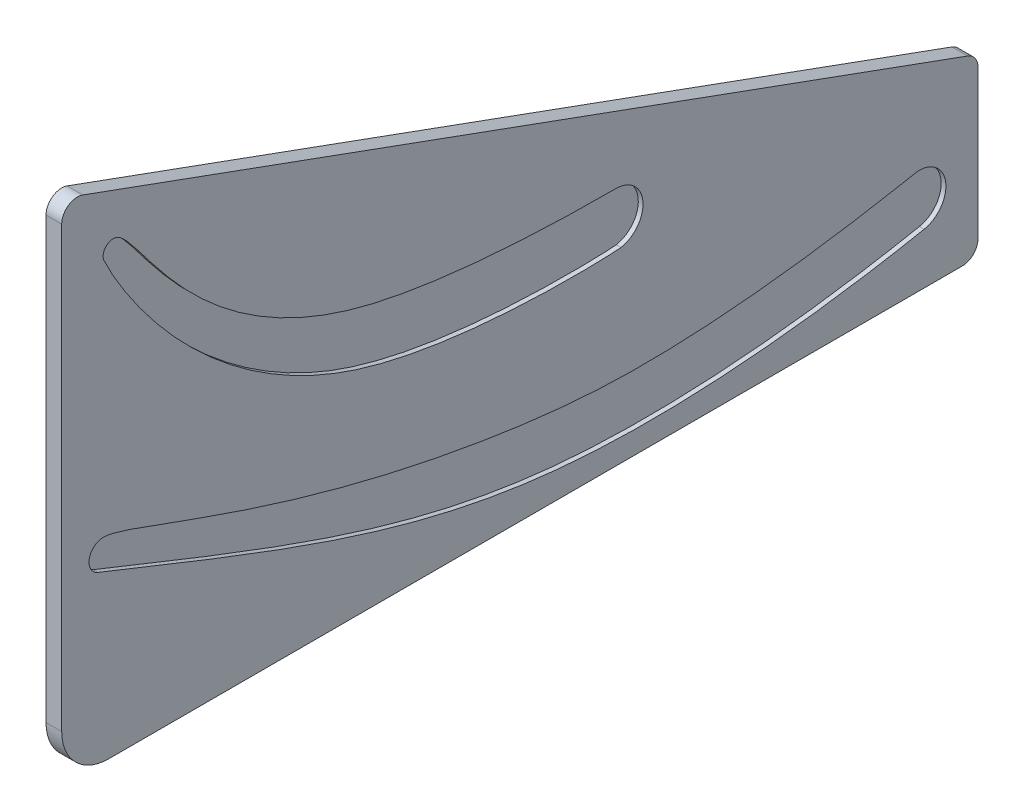
ISO-10303-21;
HEADER;
FILE_DESCRIPTION(('STEP AP214'),'2;1');
FILE_NAME('part.step','',(''),(''),'','','');
FILE_SCHEMA(('AUTOMOTIVE_DESIGN { 1 0 10303 214 1 1 1 1 }'));
ENDSEC;
DATA;
#1=APPLICATION_CONTEXT('core data for automotive mechanical design processes');
#2=APPLICATION_PROTOCOL_DEFINITION('international standard','automotive_design',2000,#1);
#3=PRODUCT_CONTEXT('',#1,'mechanical');
#4=PRODUCT('Part','Part','',(#3));
#5=PRODUCT_RELATED_PRODUCT_CATEGORY('part','',(#4));
#6=PRODUCT_DEFINITION_FORMATION('','',#4);
#7=PRODUCT_DEFINITION_CONTEXT('part definition',#1,'design');
#8=PRODUCT_DEFINITION('design','',#6,#7);
#9=PRODUCT_DEFINITION_SHAPE('','',#8);
#10=(LENGTH_UNIT() NAMED_UNIT(*) SI_UNIT(.MILLI.,.METRE.));
#11=(NAMED_UNIT(*) PLANE_ANGLE_UNIT() SI_UNIT($,.RADIAN.));
#12=(NAMED_UNIT(*) SI_UNIT($,.STERADIAN.) SOLID_ANGLE_UNIT());
#13=UNCERTAINTY_MEASURE_WITH_UNIT(LENGTH_MEASURE(1.E-05),#10,'distance_accuracy_value','');
#14=(GEOMETRIC_REPRESENTATION_CONTEXT(3) GLOBAL_UNCERTAINTY_ASSIGNED_CONTEXT((#13)) GLOBAL_UNIT_ASSIGNED_CONTEXT((#10,
#11,#12)) REPRESENTATION_CONTEXT('',''));
#15=CARTESIAN_POINT('',(0.,0.,0.));
#16=DIRECTION('',(0.,0.,1.));
#17=DIRECTION('',(1.,0.,0.));
#18=AXIS2_PLACEMENT_3D('',#15,#16,#17);
#19=CARTESIAN_POINT('',(10.,-294.281480067421,-30.));
#20=DIRECTION('',(-1.,0.,0.));
#21=DIRECTION('',(0.,0.,1.));
#22=AXIS2_PLACEMENT_3D('',#19,#20,#21);
#23=CYLINDRICAL_SURFACE('',#22,30.);
#24=CARTESIAN_POINT('',(0.,-294.281480067421,-30.));
#25=DIRECTION('',(1.,0.,0.));
#26=DIRECTION('',(0.,0.,1.));
#27=AXIS2_PLACEMENT_3D('',#24,#25,#26);
#28=CIRCLE('',#27,30.);
#29=CARTESIAN_POINT('',(0.,-294.281480067421,0.));
#30=VERTEX_POINT('',#29);
#31=CARTESIAN_POINT('',(0.,-324.281480067421,-30.));
#32=VERTEX_POINT('',#31);
#33=EDGE_CURVE('E310',#30,#32,#28,.T.);
#34=ORIENTED_EDGE('',*,*,#33,.T.);
#35=DIRECTION('',(-1.,0.,0.));
#36=VECTOR('',#35,1.);
#37=CARTESIAN_POINT('',(10.,-324.281480067421,-30.));
#38=LINE('',#37,#36);
#39=CARTESIAN_POINT('',(10.,-324.281480067421,-30.));
#40=VERTEX_POINT('',#39);
#41=EDGE_CURVE('E11',#40,#32,#38,.T.);
#42=ORIENTED_EDGE('',*,*,#41,.F.);
#43=CARTESIAN_POINT('',(10.,-294.281480067421,-30.));
#44=DIRECTION('',(1.,0.,0.));
#45=DIRECTION('',(0.,0.,1.));
#46=AXIS2_PLACEMENT_3D('',#43,#44,#45);
#47=CIRCLE('',#46,30.);
#48=CARTESIAN_POINT('',(10.,-294.281480067421,0.));
#49=VERTEX_POINT('',#48);
#50=EDGE_CURVE('E320',#49,#40,#47,.T.);
#51=ORIENTED_EDGE('',*,*,#50,.F.);
#52=DIRECTION('',(-1.,0.,0.));
#53=VECTOR('',#52,1.);
#54=CARTESIAN_POINT('',(10.,-294.281480067421,0.));
#55=LINE('',#54,#53);
#56=EDGE_CURVE('E346',#49,#30,#55,.T.);
#57=ORIENTED_EDGE('',*,*,#56,.T.);
#58=EDGE_LOOP('',(#34,#42,#51,#57));
#59=FACE_BOUND('',#58,.T.);
#60=ADVANCED_FACE('F38',(#59),#23,.T.);
#61=CARTESIAN_POINT('',(10.,-324.281480067421,-30.));
#62=DIRECTION('',(0.,1.,0.));
#63=DIRECTION('',(0.,0.,1.));
#64=AXIS2_PLACEMENT_3D('',#61,#62,#63);
#65=PLANE('',#64);
#66=DIRECTION('',(0.,0.,-1.));
#67=VECTOR('',#66,1.);
#68=CARTESIAN_POINT('',(0.,-324.281480067421,-30.));
#69=LINE('',#68,#67);
#70=CARTESIAN_POINT('',(0.,-324.281480067421,-573.815572471544));
#71=VERTEX_POINT('',#70);
#72=EDGE_CURVE('E350',#32,#71,#69,.T.);
#73=ORIENTED_EDGE('',*,*,#72,.T.);
#74=DIRECTION('',(-1.,0.,0.));
#75=VECTOR('',#74,1.);
#76=CARTESIAN_POINT('',(10.,-324.281480067421,-573.815572471544));
#77=LINE('',#76,#75);
#78=CARTESIAN_POINT('',(10.,-324.281480067421,-573.815572471544));
#79=VERTEX_POINT('',#78);
#80=EDGE_CURVE('E46',#79,#71,#77,.T.);
#81=ORIENTED_EDGE('',*,*,#80,.F.);
#82=DIRECTION('',(0.,0.,-1.));
#83=VECTOR('',#82,1.);
#84=CARTESIAN_POINT('',(10.,-324.281480067421,-30.));
#85=LINE('',#84,#83);
#86=EDGE_CURVE('E324',#40,#79,#85,.T.);
#87=ORIENTED_EDGE('',*,*,#86,.F.);
#88=ORIENTED_EDGE('',*,*,#41,.T.);
#89=EDGE_LOOP('',(#73,#81,#87,#88));
#90=FACE_BOUND('',#89,.T.);
#91=ADVANCED_FACE('F421',(#90),#65,.F.);
#92=CARTESIAN_POINT('',(10.,-314.281480067421,-573.815572471544));
#93=DIRECTION('',(-1.,0.,0.));
#94=DIRECTION('',(0.,0.,1.));
#95=AXIS2_PLACEMENT_3D('',#92,#93,#94);
#96=CYLINDRICAL_SURFACE('',#95,10.);
#97=CARTESIAN_POINT('',(0.,-314.281480067421,-573.815572471544));
#98=DIRECTION('',(1.,0.,0.));
#99=DIRECTION('',(0.,0.,-1.));
#100=AXIS2_PLACEMENT_3D('',#97,#98,#99);
#101=CIRCLE('',#100,10.);
#102=CARTESIAN_POINT('',(0.,-314.281480067421,-583.815572471544));
#103=VERTEX_POINT('',#102);
#104=EDGE_CURVE('E353',#71,#103,#101,.T.);
#105=ORIENTED_EDGE('',*,*,#104,.T.);
#106=DIRECTION('',(-1.,0.,0.));
#107=VECTOR('',#106,1.);
#108=CARTESIAN_POINT('',(10.,-314.281480067421,-583.815572471544));
#109=LINE('',#108,#107);
#110=CARTESIAN_POINT('',(10.,-314.281480067421,-583.815572471544));
#111=VERTEX_POINT('',#110);
#112=EDGE_CURVE('E389',#111,#103,#109,.T.);
#113=ORIENTED_EDGE('',*,*,#112,.F.);
#114=CARTESIAN_POINT('',(10.,-314.281480067421,-573.815572471544));
#115=DIRECTION('',(1.,0.,0.));
#116=DIRECTION('',(0.,0.,-1.));
#117=AXIS2_PLACEMENT_3D('',#114,#115,#116);
#118=CIRCLE('',#117,10.);
#119=EDGE_CURVE('E328',#79,#111,#118,.T.);
#120=ORIENTED_EDGE('',*,*,#119,.F.);
#121=ORIENTED_EDGE('',*,*,#80,.T.);
#122=EDGE_LOOP('',(#105,#113,#120,#121));
#123=FACE_BOUND('',#122,.T.);
#124=ADVANCED_FACE('F398',(#123),#96,.T.);
#125=CARTESIAN_POINT('',(10.,-314.281480067421,-583.815572471544));
#126=DIRECTION('',(0.,0.,1.));
#127=DIRECTION('',(1.,0.,0.));
#128=AXIS2_PLACEMENT_3D('',#125,#126,#127);
#129=PLANE('',#128);
#130=DIRECTION('',(0.,1.,0.));
#131=VECTOR('',#130,1.);
#132=CARTESIAN_POINT('',(0.,-314.281480067421,-583.815572471544));
#133=LINE('',#132,#131);
#134=CARTESIAN_POINT('',(0.,-219.493566062825,-583.815572471544));
#135=VERTEX_POINT('',#134);
#136=EDGE_CURVE('E356',#103,#135,#133,.T.);
#137=ORIENTED_EDGE('',*,*,#136,.T.);
#138=DIRECTION('',(-1.,0.,0.));
#139=VECTOR('',#138,1.);
#140=CARTESIAN_POINT('',(10.,-219.493566062825,-583.815572471544));
#141=LINE('',#140,#139);
#142=CARTESIAN_POINT('',(10.,-219.493566062825,-583.815572471544));
#143=VERTEX_POINT('',#142);
#144=EDGE_CURVE('E385',#143,#135,#141,.T.);
#145=ORIENTED_EDGE('',*,*,#144,.F.);
#146=DIRECTION('',(0.,1.,0.));
#147=VECTOR('',#146,1.);
#148=CARTESIAN_POINT('',(10.,-314.281480067421,-583.815572471544));
#149=LINE('',#148,#147);
#150=EDGE_CURVE('E331',#111,#143,#149,.T.);
#151=ORIENTED_EDGE('',*,*,#150,.F.);
#152=ORIENTED_EDGE('',*,*,#112,.T.);
#153=EDGE_LOOP('',(#137,#145,#151,#152));
#154=FACE_BOUND('',#153,.T.);
#155=ADVANCED_FACE('F409',(#154),#129,.F.);
#156=CARTESIAN_POINT('',(10.,-219.493566062825,-573.815572471544));
#157=DIRECTION('',(-1.,0.,0.));
#158=DIRECTION('',(0.,0.,1.));
#159=AXIS2_PLACEMENT_3D('',#156,#157,#158);
#160=CYLINDRICAL_SURFACE('',#159,10.);
#161=CARTESIAN_POINT('',(0.,-219.493566062825,-573.815572471544));
#162=DIRECTION('',(1.,0.,0.));
#163=DIRECTION('',(0.,0.,-1.));
#164=AXIS2_PLACEMENT_3D('',#161,#162,#163);
#165=CIRCLE('',#164,10.);
#166=CARTESIAN_POINT('',(0.,-210.096639854966,-577.235773904801));
#167=VERTEX_POINT('',#166);
#168=EDGE_CURVE('E359',#135,#167,#165,.T.);
#169=ORIENTED_EDGE('',*,*,#168,.T.);
#170=DIRECTION('',(-1.,0.,0.));
#171=VECTOR('',#170,1.);
#172=CARTESIAN_POINT('',(10.,-210.096639854966,-577.235773904801));
#173=LINE('',#172,#171);
#174=CARTESIAN_POINT('',(10.,-210.096639854966,-577.235773904801));
#175=VERTEX_POINT('',#174);
#176=EDGE_CURVE('E381',#175,#167,#173,.T.);
#177=ORIENTED_EDGE('',*,*,#176,.F.);
#178=CARTESIAN_POINT('',(10.,-219.493566062825,-573.815572471544));
#179=DIRECTION('',(1.,0.,0.));
#180=DIRECTION('',(0.,0.,-1.));
#181=AXIS2_PLACEMENT_3D('',#178,#179,#180);
#182=CIRCLE('',#181,10.);
#183=EDGE_CURVE('E334',#143,#175,#182,.T.);
#184=ORIENTED_EDGE('',*,*,#183,.F.);
#185=ORIENTED_EDGE('',*,*,#144,.T.);
#186=EDGE_LOOP('',(#169,#177,#184,#185));
#187=FACE_BOUND('',#186,.T.);
#188=ADVANCED_FACE('F413',(#187),#160,.T.);
#189=CARTESIAN_POINT('',(10.,-210.096639854966,-577.235773904801));
#190=DIRECTION('',(0.,-0.939692620785907,0.342020143325672));
#191=DIRECTION('',(0.,-0.342020143325672,-0.939692620785907));
#192=AXIS2_PLACEMENT_3D('',#189,#190,#191);
#193=PLANE('',#192);
#194=DIRECTION('',(0.,0.342020143325672,0.939692620785907));
#195=VECTOR('',#194,1.);
#196=CARTESIAN_POINT('',(0.,-210.096639854966,-577.235773904801));
#197=LINE('',#196,#195);
#198=CARTESIAN_POINT('',(0.,-4.88455385956217,-13.4202014332568));
#199=VERTEX_POINT('',#198);
#200=EDGE_CURVE('E362',#167,#199,#197,.T.);
#201=ORIENTED_EDGE('',*,*,#200,.T.);
#202=DIRECTION('',(-1.,0.,0.));
#203=VECTOR('',#202,1.);
#204=CARTESIAN_POINT('',(10.,-4.88455385956217,-13.4202014332568));
#205=LINE('',#204,#203);
#206=CARTESIAN_POINT('',(10.,-4.88455385956217,-13.4202014332568));
#207=VERTEX_POINT('',#206);
#208=EDGE_CURVE('E377',#207,#199,#205,.T.);
#209=ORIENTED_EDGE('',*,*,#208,.F.);
#210=DIRECTION('',(0.,0.342020143325672,0.939692620785907));
#211=VECTOR('',#210,1.);
#212=CARTESIAN_POINT('',(10.,-210.096639854966,-577.235773904801));
#213=LINE('',#212,#211);
#214=EDGE_CURVE('E337',#175,#207,#213,.T.);
#215=ORIENTED_EDGE('',*,*,#214,.F.);
#216=ORIENTED_EDGE('',*,*,#176,.T.);
#217=EDGE_LOOP('',(#201,#209,#215,#216));
#218=FACE_BOUND('',#217,.T.);
#219=ADVANCED_FACE('F434',(#218),#193,.F.);
#220=CARTESIAN_POINT('',(10.,-14.2814800674212,-10.));
#221=DIRECTION('',(-1.,0.,0.));
#222=DIRECTION('',(0.,0.,1.));
#223=AXIS2_PLACEMENT_3D('',#220,#221,#222);
#224=CYLINDRICAL_SURFACE('',#223,10.);
#225=CARTESIAN_POINT('',(0.,-14.2814800674212,-10.));
#226=DIRECTION('',(1.,0.,0.));
#227=DIRECTION('',(0.,0.,-1.));
#228=AXIS2_PLACEMENT_3D('',#225,#226,#227);
#229=CIRCLE('',#228,10.);
#230=CARTESIAN_POINT('',(0.,-14.2814800674213,0.));
#231=VERTEX_POINT('',#230);
#232=EDGE_CURVE('E365',#199,#231,#229,.T.);
#233=ORIENTED_EDGE('',*,*,#232,.T.);
#234=DIRECTION('',(-1.,0.,0.));
#235=VECTOR('',#234,1.);
#236=CARTESIAN_POINT('',(10.,-14.2814800674213,0.));
#237=LINE('',#236,#235);
#238=CARTESIAN_POINT('',(10.,-14.2814800674213,0.));
#239=VERTEX_POINT('',#238);
#240=EDGE_CURVE('E373',#239,#231,#237,.T.);
#241=ORIENTED_EDGE('',*,*,#240,.F.);
#242=CARTESIAN_POINT('',(10.,-14.2814800674212,-10.));
#243=DIRECTION('',(1.,0.,0.));
#244=DIRECTION('',(0.,0.,-1.));
#245=AXIS2_PLACEMENT_3D('',#242,#243,#244);
#246=CIRCLE('',#245,10.);
#247=EDGE_CURVE('E340',#207,#239,#246,.T.);
#248=ORIENTED_EDGE('',*,*,#247,.F.);
#249=ORIENTED_EDGE('',*,*,#208,.T.);
#250=EDGE_LOOP('',(#233,#241,#248,#249));
#251=FACE_BOUND('',#250,.T.);
#252=ADVANCED_FACE('F432',(#251),#224,.T.);
#253=CARTESIAN_POINT('',(10.,-14.2814800674213,0.));
#254=DIRECTION('',(0.,0.,-1.));
#255=DIRECTION('',(0.,1.,0.));
#256=AXIS2_PLACEMENT_3D('',#253,#254,#255);
#257=PLANE('',#256);
#258=DIRECTION('',(0.,-1.,0.));
#259=VECTOR('',#258,1.);
#260=CARTESIAN_POINT('',(0.,-14.2814800674213,0.));
#261=LINE('',#260,#259);
#262=EDGE_CURVE('E325',#231,#30,#261,.T.);
#263=ORIENTED_EDGE('',*,*,#262,.T.);
#264=ORIENTED_EDGE('',*,*,#56,.F.);
#265=DIRECTION('',(0.,-1.,0.));
#266=VECTOR('',#265,1.);
#267=CARTESIAN_POINT('',(10.,-14.2814800674213,0.));
#268=LINE('',#267,#266);
#269=EDGE_CURVE('E343',#239,#49,#268,.T.);
#270=ORIENTED_EDGE('',*,*,#269,.F.);
#271=ORIENTED_EDGE('',*,*,#240,.T.);
#272=EDGE_LOOP('',(#263,#264,#270,#271));
#273=FACE_BOUND('',#272,.T.);
#274=ADVANCED_FACE('F427',(#273),#257,.F.);
#275=CARTESIAN_POINT('',(10.,-294.281480067421,-30.));
#276=DIRECTION('',(-1.,0.,0.));
#277=DIRECTION('',(0.,0.,1.));
#278=AXIS2_PLACEMENT_3D('',#275,#276,#277);
#279=PLANE('',#278);
#280=CARTESIAN_POINT('',(10.,-45.1404123394199,-32.8167854808913));
#281=DIRECTION('',(1.,0.,0.));
#282=DIRECTION('',(0.,0.,1.));
#283=AXIS2_PLACEMENT_3D('',#280,#281,#282);
#284=CIRCLE('',#283,6.41563538252756);
#285=CARTESIAN_POINT('',(10.,-39.1543533593346,-35.1249178966076));
#286=VERTEX_POINT('',#285);
#287=CARTESIAN_POINT('',(10.,-47.7372149956287,-26.9501856712703));
#288=VERTEX_POINT('',#287);
#289=EDGE_CURVE('E638',#286,#288,#284,.T.);
#290=ORIENTED_EDGE('',*,*,#289,.F.);
#291=CARTESIAN_POINT('',(10.,-171.181734297002,-353.169530365349));
#292=CARTESIAN_POINT('',(10.,-171.181746235272,-331.224003862466));
#293=CARTESIAN_POINT('',(10.,-170.661871262547,-99.0425390004754));
#294=CARTESIAN_POINT('',(10.,-45.1224459351378,-50.6029528282735));
#295=CARTESIAN_POINT('',(10.,-39.1543533593346,-35.1249178966076));
#296=B_SPLINE_CURVE_WITH_KNOTS('',3,(#291,#292,#293,#294,#295),.UNSPECIFIED.,.F.,.F.,(4,1,4),
(0.,0.360804402812459,1.),.UNSPECIFIED.);
#297=CARTESIAN_POINT('',(10.,-171.181734297002,-353.169530365349));
#298=VERTEX_POINT('',#297);
#299=EDGE_CURVE('E61',#298,#286,#296,.T.);
#300=ORIENTED_EDGE('',*,*,#299,.F.);
#301=CARTESIAN_POINT('',(10.,-188.394419043439,-353.169539728973));
#302=DIRECTION('',(1.,0.,0.));
#303=DIRECTION('',(0.,0.,-1.));
#304=AXIS2_PLACEMENT_3D('',#301,#302,#303);
#305=CIRCLE('',#304,17.2126847464395);
#306=CARTESIAN_POINT('',(10.,-205.316311304833,-356.320107689534));
#307=VERTEX_POINT('',#306);
#308=EDGE_CURVE('E233',#307,#298,#305,.T.);
#309=ORIENTED_EDGE('',*,*,#308,.F.);
#310=CARTESIAN_POINT('',(10.,-47.7372149956287,-26.9501856712703));
#311=CARTESIAN_POINT('',(10.,-66.6295550857602,-35.3127262433403));
#312=CARTESIAN_POINT('',(10.,-217.989087479131,-121.396454164475));
#313=CARTESIAN_POINT('',(10.,-205.964445920581,-352.838937222534));
#314=CARTESIAN_POINT('',(10.,-205.316311304833,-356.320107689534));
#315=B_SPLINE_CURVE_WITH_KNOTS('',3,(#310,#311,#312,#313,#314),.UNSPECIFIED.,.F.,.F.,(4,1,4),
(0.,0.590315330441631,1.),.UNSPECIFIED.);
#316=EDGE_CURVE('E645',#288,#307,#315,.T.);
#317=ORIENTED_EDGE('',*,*,#316,.F.);
#318=EDGE_LOOP('',(#290,#300,#309,#317));
#319=FACE_BOUND('',#318,.T.);
#320=CARTESIAN_POINT('',(10.,-274.942255754465,-546.15811937726));
#321=DIRECTION('',(1.,0.,0.));
#322=DIRECTION('',(0.,0.,-1.));
#323=AXIS2_PLACEMENT_3D('',#320,#321,#322);
#324=CIRCLE('',#323,17.2112260755335);
#325=CARTESIAN_POINT('',(10.,-291.831036848789,-549.474047025916));
#326=VERTEX_POINT('',#325);
#327=CARTESIAN_POINT('',(10.,-257.731029978854,-546.154906268973));
#328=VERTEX_POINT('',#327);
#329=EDGE_CURVE('E285',#326,#328,#324,.T.);
#330=ORIENTED_EDGE('',*,*,#329,.F.);
#331=CARTESIAN_POINT('',(10.,-218.017297736922,-23.1621757846725));
#332=CARTESIAN_POINT('',(10.,-266.034178467192,-143.080818041075));
#333=CARTESIAN_POINT('',(10.,-324.572171749127,-284.669923622883));
#334=CARTESIAN_POINT('',(10.,-306.502271197421,-474.750080898962));
#335=CARTESIAN_POINT('',(10.,-291.831036848789,-549.474047025916));
#336=B_SPLINE_CURVE_WITH_KNOTS('',3,(#331,#332,#333,#334,#335),.UNSPECIFIED.,.F.,.F.,(4,1,4),
(0.,0.576111685978495,1.),.UNSPECIFIED.);
#337=CARTESIAN_POINT('',(10.,-218.017297736922,-23.1621757846725));
#338=VERTEX_POINT('',#337);
#339=EDGE_CURVE('E280',#338,#326,#336,.T.);
#340=ORIENTED_EDGE('',*,*,#339,.F.);
#341=CARTESIAN_POINT('',(10.,-209.495939813425,-26.5742309862116));
#342=DIRECTION('',(1.,0.,0.));
#343=DIRECTION('',(0.,0.,1.));
#344=AXIS2_PLACEMENT_3D('',#341,#342,#343);
#345=CIRCLE('',#344,9.17908827491534);
#346=CARTESIAN_POINT('',(10.,-200.318314743193,-26.7381200613058));
#347=VERTEX_POINT('',#346);
#348=EDGE_CURVE('E299',#347,#338,#345,.T.);
#349=ORIENTED_EDGE('',*,*,#348,.F.);
#350=CARTESIAN_POINT('',(10.,-257.731029978854,-546.154906268973));
#351=CARTESIAN_POINT('',(10.,-257.731725159021,-542.431128001591));
#352=CARTESIAN_POINT('',(10.,-286.385074175091,-414.880335600918));
#353=CARTESIAN_POINT('',(10.,-255.510398156368,-151.321073340182));
#354=CARTESIAN_POINT('',(10.,-200.660753586686,-45.9143544336099));
#355=CARTESIAN_POINT('',(10.,-200.318314743193,-26.7381200613058));
#356=B_SPLINE_CURVE_WITH_KNOTS('',3,(#350,#351,#352,#353,#354,#355),.UNSPECIFIED.,.F.,.F.,(4,1,
1,4),(0.,0.339064775990525,0.439064775990525,1.),.UNSPECIFIED.);
#357=EDGE_CURVE('E293',#328,#347,#356,.T.);
#358=ORIENTED_EDGE('',*,*,#357,.F.);
#359=EDGE_LOOP('',(#330,#340,#349,#358));
#360=FACE_BOUND('',#359,.T.);
#361=ORIENTED_EDGE('',*,*,#50,.T.);
#362=ORIENTED_EDGE('',*,*,#86,.T.);
#363=ORIENTED_EDGE('',*,*,#119,.T.);
#364=ORIENTED_EDGE('',*,*,#150,.T.);
#365=ORIENTED_EDGE('',*,*,#183,.T.);
#366=ORIENTED_EDGE('',*,*,#214,.T.);
#367=ORIENTED_EDGE('',*,*,#247,.T.);
#368=ORIENTED_EDGE('',*,*,#269,.T.);
#369=EDGE_LOOP('',(#361,#362,#363,#364,#365,#366,#367,#368));
#370=FACE_BOUND('',#369,.T.);
#371=ADVANCED_FACE('F417',(#319,#360,#370),#279,.F.);
#372=CARTESIAN_POINT('',(0.,-294.281480067421,-30.));
#373=DIRECTION('',(-1.,0.,0.));
#374=DIRECTION('',(0.,0.,1.));
#375=AXIS2_PLACEMENT_3D('',#372,#373,#374);
#376=PLANE('',#375);
#377=CARTESIAN_POINT('',(0.,-305.630106088856,-561.587294138042));
#378=DIRECTION('',(-1.,0.,0.));
#379=DIRECTION('',(0.,0.,1.));
#380=AXIS2_PLACEMENT_3D('',#377,#378,#379);
#381=CIRCLE('',#380,9.00000000000001);
#382=CARTESIAN_POINT('',(0.,-296.630106088856,-561.587294138042));
#383=VERTEX_POINT('',#382);
#384=CARTESIAN_POINT('',(0.,-314.630106088856,-561.587294138042));
#385=VERTEX_POINT('',#384);
#386=EDGE_CURVE('E53',#383,#385,#381,.T.);
#387=ORIENTED_EDGE('',*,*,#386,.F.);
#388=DIRECTION('',(0.,0.,-1.));
#389=VECTOR('',#388,1.);
#390=CARTESIAN_POINT('',(0.,-296.630106088856,-561.587294138042));
#391=LINE('',#390,#389);
#392=CARTESIAN_POINT('',(0.,-296.630106088856,-27.2919792728029));
#393=VERTEX_POINT('',#392);
#394=EDGE_CURVE('E198',#393,#383,#391,.T.);
#395=ORIENTED_EDGE('',*,*,#394,.F.);
#396=CARTESIAN_POINT('',(0.,-305.630106088856,-27.2919792728029));
#397=DIRECTION('',(-1.,0.,0.));
#398=DIRECTION('',(0.,0.,1.));
#399=AXIS2_PLACEMENT_3D('',#396,#397,#398);
#400=CIRCLE('',#399,8.99999999999995);
#401=CARTESIAN_POINT('',(0.,-314.630106088856,-27.2919792728029));
#402=VERTEX_POINT('',#401);
#403=EDGE_CURVE('E202',#402,#393,#400,.T.);
#404=ORIENTED_EDGE('',*,*,#403,.F.);
#405=DIRECTION('',(0.,0.,1.));
#406=VECTOR('',#405,1.);
#407=CARTESIAN_POINT('',(0.,-314.630106088856,-561.587294138042));
#408=LINE('',#407,#406);
#409=EDGE_CURVE('E211',#385,#402,#408,.T.);
#410=ORIENTED_EDGE('',*,*,#409,.F.);
#411=EDGE_LOOP('',(#387,#395,#404,#410));
#412=FACE_BOUND('',#411,.T.);
#413=ORIENTED_EDGE('',*,*,#33,.F.);
#414=ORIENTED_EDGE('',*,*,#262,.F.);
#415=ORIENTED_EDGE('',*,*,#232,.F.);
#416=ORIENTED_EDGE('',*,*,#200,.F.);
#417=ORIENTED_EDGE('',*,*,#168,.F.);
#418=ORIENTED_EDGE('',*,*,#136,.F.);
#419=ORIENTED_EDGE('',*,*,#104,.F.);
#420=ORIENTED_EDGE('',*,*,#72,.F.);
#421=EDGE_LOOP('',(#413,#414,#415,#416,#417,#418,#419,#420));
#422=FACE_BOUND('',#421,.T.);
#423=ADVANCED_FACE('F404',(#412,#422),#376,.T.);
#424=CARTESIAN_POINT('',(7.,-218.017297736922,-23.1621757846725));
#425=CARTESIAN_POINT('',(7.,-266.034178467192,-143.080818041075));
#426=CARTESIAN_POINT('',(7.,-324.572171749127,-284.669923622883));
#427=CARTESIAN_POINT('',(7.,-306.502271197421,-474.750080898962));
#428=CARTESIAN_POINT('',(7.,-291.831036848789,-549.474047025916));
#429=B_SPLINE_CURVE_WITH_KNOTS('',3,(#424,#425,#426,#427,#428),.UNSPECIFIED.,.F.,.F.,(4,1,4),
(0.,0.576111685978495,1.),.UNSPECIFIED.);
#430=DIRECTION('',(1.,0.,0.));
#431=VECTOR('',#430,1.);
#432=SURFACE_OF_LINEAR_EXTRUSION('',#429,#431);
#433=ORIENTED_EDGE('',*,*,#339,.T.);
#434=DIRECTION('',(1.,0.,0.));
#435=VECTOR('',#434,1.);
#436=CARTESIAN_POINT('',(7.,-291.831036848789,-549.474047025916));
#437=LINE('',#436,#435);
#438=CARTESIAN_POINT('',(7.,-291.831036848789,-549.474047025916));
#439=VERTEX_POINT('',#438);
#440=EDGE_CURVE('E279',#439,#326,#437,.T.);
#441=ORIENTED_EDGE('',*,*,#440,.F.);
#442=CARTESIAN_POINT('',(7.,-218.017297736922,-23.1621757846725));
#443=VERTEX_POINT('',#442);
#444=EDGE_CURVE('E306',#443,#439,#429,.T.);
#445=ORIENTED_EDGE('',*,*,#444,.F.);
#446=DIRECTION('',(1.,0.,0.));
#447=VECTOR('',#446,1.);
#448=CARTESIAN_POINT('',(7.,-218.017297736922,-23.1621757846725));
#449=LINE('',#448,#447);
#450=EDGE_CURVE('E307',#443,#338,#449,.T.);
#451=ORIENTED_EDGE('',*,*,#450,.T.);
#452=EDGE_LOOP('',(#433,#441,#445,#451));
#453=FACE_BOUND('',#452,.T.);
#454=ADVANCED_FACE('F255',(#453),#432,.F.);
#455=CARTESIAN_POINT('',(7.,-209.495939813425,-26.5742309862116));
#456=DIRECTION('',(1.,0.,0.));
#457=DIRECTION('',(0.,0.,-1.));
#458=AXIS2_PLACEMENT_3D('',#455,#456,#457);
#459=CYLINDRICAL_SURFACE('',#458,9.17908827491534);
#460=ORIENTED_EDGE('',*,*,#348,.T.);
#461=ORIENTED_EDGE('',*,*,#450,.F.);
#462=CARTESIAN_POINT('',(7.,-209.495939813425,-26.5742309862116));
#463=DIRECTION('',(1.,0.,0.));
#464=DIRECTION('',(0.,0.,1.));
#465=AXIS2_PLACEMENT_3D('',#462,#463,#464);
#466=CIRCLE('',#465,9.17908827491534);
#467=CARTESIAN_POINT('',(7.,-200.318314743193,-26.7381200613058));
#468=VERTEX_POINT('',#467);
#469=EDGE_CURVE('E270',#468,#443,#466,.T.);
#470=ORIENTED_EDGE('',*,*,#469,.F.);
#471=DIRECTION('',(1.,0.,0.));
#472=VECTOR('',#471,1.);
#473=CARTESIAN_POINT('',(7.,-200.318314743193,-26.7381200613058));
#474=LINE('',#473,#472);
#475=EDGE_CURVE('E311',#468,#347,#474,.T.);
#476=ORIENTED_EDGE('',*,*,#475,.T.);
#477=EDGE_LOOP('',(#460,#461,#470,#476));
#478=FACE_BOUND('',#477,.T.);
#479=ADVANCED_FACE('F251',(#478),#459,.F.);
#480=CARTESIAN_POINT('',(7.,-257.731029978854,-546.154906268973));
#481=CARTESIAN_POINT('',(7.,-257.731725159021,-542.431128001591));
#482=CARTESIAN_POINT('',(7.,-286.385074175091,-414.880335600918));
#483=CARTESIAN_POINT('',(7.,-255.510398156368,-151.321073340182));
#484=CARTESIAN_POINT('',(7.,-200.660753586686,-45.9143544336099));
#485=CARTESIAN_POINT('',(7.,-200.318314743193,-26.7381200613058));
#486=B_SPLINE_CURVE_WITH_KNOTS('',3,(#480,#481,#482,#483,#484,#485),.UNSPECIFIED.,.F.,.F.,(4,1,
1,4),(0.,0.339064775990525,0.439064775990525,1.),.UNSPECIFIED.);
#487=DIRECTION('',(1.,0.,0.));
#488=VECTOR('',#487,1.);
#489=SURFACE_OF_LINEAR_EXTRUSION('',#486,#488);
#490=ORIENTED_EDGE('',*,*,#357,.T.);
#491=ORIENTED_EDGE('',*,*,#475,.F.);
#492=CARTESIAN_POINT('',(7.,-257.731029978854,-546.154906268973));
#493=VERTEX_POINT('',#492);
#494=EDGE_CURVE('E262',#493,#468,#486,.T.);
#495=ORIENTED_EDGE('',*,*,#494,.F.);
#496=DIRECTION('',(1.,0.,0.));
#497=VECTOR('',#496,1.);
#498=CARTESIAN_POINT('',(7.,-257.731029978854,-546.154906268973));
#499=LINE('',#498,#497);
#500=EDGE_CURVE('E314',#493,#328,#499,.T.);
#501=ORIENTED_EDGE('',*,*,#500,.T.);
#502=EDGE_LOOP('',(#490,#491,#495,#501));
#503=FACE_BOUND('',#502,.T.);
#504=ADVANCED_FACE('F254',(#503),#489,.F.);
#505=CARTESIAN_POINT('',(7.,-274.942255754465,-546.15811937726));
#506=DIRECTION('',(1.,0.,0.));
#507=DIRECTION('',(0.,0.,-1.));
#508=AXIS2_PLACEMENT_3D('',#505,#506,#507);
#509=CYLINDRICAL_SURFACE('',#508,17.2112260755335);
#510=ORIENTED_EDGE('',*,*,#329,.T.);
#511=ORIENTED_EDGE('',*,*,#500,.F.);
#512=CARTESIAN_POINT('',(7.,-274.942255754465,-546.15811937726));
#513=DIRECTION('',(1.,0.,0.));
#514=DIRECTION('',(0.,0.,-1.));
#515=AXIS2_PLACEMENT_3D('',#512,#513,#514);
#516=CIRCLE('',#515,17.2112260755335);
#517=EDGE_CURVE('E271',#439,#493,#516,.T.);
#518=ORIENTED_EDGE('',*,*,#517,.F.);
#519=ORIENTED_EDGE('',*,*,#440,.T.);
#520=EDGE_LOOP('',(#510,#511,#518,#519));
#521=FACE_BOUND('',#520,.T.);
#522=ADVANCED_FACE('F249',(#521),#509,.F.);
#523=CARTESIAN_POINT('',(7.,-303.462035884563,-284.326105547402));
#524=DIRECTION('',(1.,0.,0.));
#525=DIRECTION('',(0.,0.,-1.));
#526=AXIS2_PLACEMENT_3D('',#523,#524,#525);
#527=PLANE('',#526);
#528=ORIENTED_EDGE('',*,*,#444,.T.);
#529=ORIENTED_EDGE('',*,*,#517,.T.);
#530=ORIENTED_EDGE('',*,*,#494,.T.);
#531=ORIENTED_EDGE('',*,*,#469,.T.);
#532=EDGE_LOOP('',(#528,#529,#530,#531));
#533=FACE_BOUND('',#532,.T.);
#534=ADVANCED_FACE('F244',(#533),#527,.T.);
#535=CARTESIAN_POINT('',(7.,-171.181734297002,-353.169530365349));
#536=CARTESIAN_POINT('',(7.,-171.181746235272,-331.224003862466));
#537=CARTESIAN_POINT('',(7.,-170.661871262547,-99.0425390004754));
#538=CARTESIAN_POINT('',(7.,-45.1224459351378,-50.6029528282735));
#539=CARTESIAN_POINT('',(7.,-39.1543533593346,-35.1249178966076));
#540=B_SPLINE_CURVE_WITH_KNOTS('',3,(#535,#536,#537,#538,#539),.UNSPECIFIED.,.F.,.F.,(4,1,4),
(0.,0.360804402812459,1.),.UNSPECIFIED.);
#541=DIRECTION('',(1.,0.,0.));
#542=VECTOR('',#541,1.);
#543=SURFACE_OF_LINEAR_EXTRUSION('',#540,#542);
#544=ORIENTED_EDGE('',*,*,#299,.T.);
#545=DIRECTION('',(1.,0.,0.));
#546=VECTOR('',#545,1.);
#547=CARTESIAN_POINT('',(7.,-39.1543533593346,-35.1249178966076));
#548=LINE('',#547,#546);
#549=CARTESIAN_POINT('',(7.,-39.1543533593346,-35.1249178966076));
#550=VERTEX_POINT('',#549);
#551=EDGE_CURVE('E633',#550,#286,#548,.T.);
#552=ORIENTED_EDGE('',*,*,#551,.F.);
#553=CARTESIAN_POINT('',(7.,-171.181734297002,-353.169530365349));
#554=VERTEX_POINT('',#553);
#555=EDGE_CURVE('E225',#554,#550,#540,.T.);
#556=ORIENTED_EDGE('',*,*,#555,.F.);
#557=DIRECTION('',(1.,0.,0.));
#558=VECTOR('',#557,1.);
#559=CARTESIAN_POINT('',(7.,-171.181734297002,-353.169530365349));
#560=LINE('',#559,#558);
#561=EDGE_CURVE('E286',#554,#298,#560,.T.);
#562=ORIENTED_EDGE('',*,*,#561,.T.);
#563=EDGE_LOOP('',(#544,#552,#556,#562));
#564=FACE_BOUND('',#563,.T.);
#565=ADVANCED_FACE('F239',(#564),#543,.F.);
#566=CARTESIAN_POINT('',(7.,-188.394419043439,-353.169539728973));
#567=DIRECTION('',(1.,0.,0.));
#568=DIRECTION('',(0.,0.,-1.));
#569=AXIS2_PLACEMENT_3D('',#566,#567,#568);
#570=CYLINDRICAL_SURFACE('',#569,17.2126847464395);
#571=ORIENTED_EDGE('',*,*,#308,.T.);
#572=ORIENTED_EDGE('',*,*,#561,.F.);
#573=CARTESIAN_POINT('',(7.,-188.394419043439,-353.169539728973));
#574=DIRECTION('',(1.,0.,0.));
#575=DIRECTION('',(0.,0.,-1.));
#576=AXIS2_PLACEMENT_3D('',#573,#574,#575);
#577=CIRCLE('',#576,17.2126847464395);
#578=CARTESIAN_POINT('',(7.,-205.316311304833,-356.320107689534));
#579=VERTEX_POINT('',#578);
#580=EDGE_CURVE('E626',#579,#554,#577,.T.);
#581=ORIENTED_EDGE('',*,*,#580,.F.);
#582=DIRECTION('',(1.,0.,0.));
#583=VECTOR('',#582,1.);
#584=CARTESIAN_POINT('',(7.,-205.316311304833,-356.320107689534));
#585=LINE('',#584,#583);
#586=EDGE_CURVE('E659',#579,#307,#585,.T.);
#587=ORIENTED_EDGE('',*,*,#586,.T.);
#588=EDGE_LOOP('',(#571,#572,#581,#587));
#589=FACE_BOUND('',#588,.T.);
#590=ADVANCED_FACE('F243',(#589),#570,.F.);
#591=CARTESIAN_POINT('',(7.,-47.7372149956287,-26.9501856712703));
#592=CARTESIAN_POINT('',(7.,-66.6295550857602,-35.3127262433403));
#593=CARTESIAN_POINT('',(7.,-217.989087479131,-121.396454164475));
#594=CARTESIAN_POINT('',(7.,-205.964445920581,-352.838937222534));
#595=CARTESIAN_POINT('',(7.,-205.316311304833,-356.320107689534));
#596=B_SPLINE_CURVE_WITH_KNOTS('',3,(#591,#592,#593,#594,#595),.UNSPECIFIED.,.F.,.F.,(4,1,4),
(0.,0.590315330441631,1.),.UNSPECIFIED.);
#597=DIRECTION('',(1.,0.,0.));
#598=VECTOR('',#597,1.);
#599=SURFACE_OF_LINEAR_EXTRUSION('',#596,#598);
#600=ORIENTED_EDGE('',*,*,#316,.T.);
#601=ORIENTED_EDGE('',*,*,#586,.F.);
#602=CARTESIAN_POINT('',(7.,-47.7372149956287,-26.9501856712703));
#603=VERTEX_POINT('',#602);
#604=EDGE_CURVE('E619',#603,#579,#596,.T.);
#605=ORIENTED_EDGE('',*,*,#604,.F.);
#606=DIRECTION('',(1.,0.,0.));
#607=VECTOR('',#606,1.);
#608=CARTESIAN_POINT('',(7.,-47.7372149956287,-26.9501856712703));
#609=LINE('',#608,#607);
#610=EDGE_CURVE('E662',#603,#288,#609,.T.);
#611=ORIENTED_EDGE('',*,*,#610,.T.);
#612=EDGE_LOOP('',(#600,#601,#605,#611));
#613=FACE_BOUND('',#612,.T.);
#614=ADVANCED_FACE('F539',(#613),#599,.F.);
#615=CARTESIAN_POINT('',(7.,-45.1404123394199,-32.8167854808913));
#616=DIRECTION('',(1.,0.,0.));
#617=DIRECTION('',(0.,0.,-1.));
#618=AXIS2_PLACEMENT_3D('',#615,#616,#617);
#619=CYLINDRICAL_SURFACE('',#618,6.41563538252756);
#620=ORIENTED_EDGE('',*,*,#289,.T.);
#621=ORIENTED_EDGE('',*,*,#610,.F.);
#622=CARTESIAN_POINT('',(7.,-45.1404123394199,-32.8167854808913));
#623=DIRECTION('',(1.,0.,0.));
#624=DIRECTION('',(0.,0.,1.));
#625=AXIS2_PLACEMENT_3D('',#622,#623,#624);
#626=CIRCLE('',#625,6.41563538252756);
#627=EDGE_CURVE('E232',#550,#603,#626,.T.);
#628=ORIENTED_EDGE('',*,*,#627,.F.);
#629=ORIENTED_EDGE('',*,*,#551,.T.);
#630=EDGE_LOOP('',(#620,#621,#628,#629));
#631=FACE_BOUND('',#630,.T.);
#632=ADVANCED_FACE('F245',(#631),#619,.F.);
#633=CARTESIAN_POINT('',(7.,-129.505777713154,-128.392117156116));
#634=DIRECTION('',(1.,0.,0.));
#635=DIRECTION('',(0.,0.,-1.));
#636=AXIS2_PLACEMENT_3D('',#633,#634,#635);
#637=PLANE('',#636);
#638=ORIENTED_EDGE('',*,*,#555,.T.);
#639=ORIENTED_EDGE('',*,*,#627,.T.);
#640=ORIENTED_EDGE('',*,*,#604,.T.);
#641=ORIENTED_EDGE('',*,*,#580,.T.);
#642=EDGE_LOOP('',(#638,#639,#640,#641));
#643=FACE_BOUND('',#642,.T.);
#644=ADVANCED_FACE('F557',(#643),#637,.T.);
#645=CARTESIAN_POINT('',(3.,-305.630106088856,-561.587294138042));
#646=DIRECTION('',(-1.,0.,0.));
#647=DIRECTION('',(0.,0.,1.));
#648=AXIS2_PLACEMENT_3D('',#645,#646,#647);
#649=CYLINDRICAL_SURFACE('',#648,9.00000000000001);
#650=ORIENTED_EDGE('',*,*,#386,.T.);
#651=DIRECTION('',(-1.,0.,0.));
#652=VECTOR('',#651,1.);
#653=CARTESIAN_POINT('',(3.,-314.630106088856,-561.587294138042));
#654=LINE('',#653,#652);
#655=CARTESIAN_POINT('',(3.,-314.630106088856,-561.587294138042));
#656=VERTEX_POINT('',#655);
#657=EDGE_CURVE('E173',#656,#385,#654,.T.);
#658=ORIENTED_EDGE('',*,*,#657,.F.);
#659=CARTESIAN_POINT('',(3.,-305.630106088856,-561.587294138042));
#660=DIRECTION('',(-1.,0.,0.));
#661=DIRECTION('',(0.,0.,1.));
#662=AXIS2_PLACEMENT_3D('',#659,#660,#661);
#663=CIRCLE('',#662,9.00000000000001);
#664=CARTESIAN_POINT('',(3.,-296.630106088856,-561.587294138042));
#665=VERTEX_POINT('',#664);
#666=EDGE_CURVE('E177',#665,#656,#663,.T.);
#667=ORIENTED_EDGE('',*,*,#666,.F.);
#668=DIRECTION('',(-1.,0.,0.));
#669=VECTOR('',#668,1.);
#670=CARTESIAN_POINT('',(3.,-296.630106088856,-561.587294138042));
#671=LINE('',#670,#669);
#672=EDGE_CURVE('E217',#665,#383,#671,.T.);
#673=ORIENTED_EDGE('',*,*,#672,.T.);
#674=EDGE_LOOP('',(#650,#658,#667,#673));
#675=FACE_BOUND('',#674,.T.);
#676=ADVANCED_FACE('F175',(#675),#649,.F.);
#677=CARTESIAN_POINT('',(3.,-296.630106088856,-561.587294138042));
#678=DIRECTION('',(0.,1.,0.));
#679=DIRECTION('',(0.,0.,1.));
#680=AXIS2_PLACEMENT_3D('',#677,#678,#679);
#681=PLANE('',#680);
#682=ORIENTED_EDGE('',*,*,#394,.T.);
#683=ORIENTED_EDGE('',*,*,#672,.F.);
#684=DIRECTION('',(0.,0.,-1.));
#685=VECTOR('',#684,1.);
#686=CARTESIAN_POINT('',(3.,-296.630106088856,-561.587294138042));
#687=LINE('',#686,#685);
#688=CARTESIAN_POINT('',(3.,-296.630106088856,-27.2919792728029));
#689=VERTEX_POINT('',#688);
#690=EDGE_CURVE('E184',#689,#665,#687,.T.);
#691=ORIENTED_EDGE('',*,*,#690,.F.);
#692=DIRECTION('',(-1.,0.,0.));
#693=VECTOR('',#692,1.);
#694=CARTESIAN_POINT('',(3.,-296.630106088856,-27.2919792728029));
#695=LINE('',#694,#693);
#696=EDGE_CURVE('E220',#689,#393,#695,.T.);
#697=ORIENTED_EDGE('',*,*,#696,.T.);
#698=EDGE_LOOP('',(#682,#683,#691,#697));
#699=FACE_BOUND('',#698,.T.);
#700=ADVANCED_FACE('F580',(#699),#681,.F.);
#701=CARTESIAN_POINT('',(3.,-305.630106088856,-27.2919792728029));
#702=DIRECTION('',(-1.,0.,0.));
#703=DIRECTION('',(0.,0.,1.));
#704=AXIS2_PLACEMENT_3D('',#701,#702,#703);
#705=CYLINDRICAL_SURFACE('',#704,8.99999999999995);
#706=ORIENTED_EDGE('',*,*,#403,.T.);
#707=ORIENTED_EDGE('',*,*,#696,.F.);
#708=CARTESIAN_POINT('',(3.,-305.630106088856,-27.2919792728029));
#709=DIRECTION('',(-1.,0.,0.));
#710=DIRECTION('',(0.,0.,1.));
#711=AXIS2_PLACEMENT_3D('',#708,#709,#710);
#712=CIRCLE('',#711,8.99999999999995);
#713=CARTESIAN_POINT('',(3.,-314.630106088856,-27.2919792728029));
#714=VERTEX_POINT('',#713);
#715=EDGE_CURVE('E193',#714,#689,#712,.T.);
#716=ORIENTED_EDGE('',*,*,#715,.F.);
#717=DIRECTION('',(-1.,0.,0.));
#718=VECTOR('',#717,1.);
#719=CARTESIAN_POINT('',(3.,-314.630106088856,-27.2919792728029));
#720=LINE('',#719,#718);
#721=EDGE_CURVE('E183',#714,#402,#720,.T.);
#722=ORIENTED_EDGE('',*,*,#721,.T.);
#723=EDGE_LOOP('',(#706,#707,#716,#722));
#724=FACE_BOUND('',#723,.T.);
#725=ADVANCED_FACE('F589',(#724),#705,.F.);
#726=CARTESIAN_POINT('',(3.,-314.630106088856,-561.587294138042));
#727=DIRECTION('',(0.,-1.,0.));
#728=DIRECTION('',(0.,0.,-1.));
#729=AXIS2_PLACEMENT_3D('',#726,#727,#728);
#730=PLANE('',#729);
#731=ORIENTED_EDGE('',*,*,#409,.T.);
#732=ORIENTED_EDGE('',*,*,#721,.F.);
#733=DIRECTION('',(0.,0.,1.));
#734=VECTOR('',#733,1.);
#735=CARTESIAN_POINT('',(3.,-314.630106088856,-561.587294138042));
#736=LINE('',#735,#734);
#737=EDGE_CURVE('E187',#656,#714,#736,.T.);
#738=ORIENTED_EDGE('',*,*,#737,.F.);
#739=ORIENTED_EDGE('',*,*,#657,.T.);
#740=EDGE_LOOP('',(#731,#732,#738,#739));
#741=FACE_BOUND('',#740,.T.);
#742=ADVANCED_FACE('F188',(#741),#730,.F.);
#743=CARTESIAN_POINT('',(3.,-305.630106088856,-561.587294138042));
#744=DIRECTION('',(-1.,0.,0.));
#745=DIRECTION('',(0.,0.,1.));
#746=AXIS2_PLACEMENT_3D('',#743,#744,#745);
#747=PLANE('',#746);
#748=ORIENTED_EDGE('',*,*,#666,.T.);
#749=ORIENTED_EDGE('',*,*,#737,.T.);
#750=ORIENTED_EDGE('',*,*,#715,.T.);
#751=ORIENTED_EDGE('',*,*,#690,.T.);
#752=EDGE_LOOP('',(#748,#749,#750,#751));
#753=FACE_BOUND('',#752,.T.);
#754=ADVANCED_FACE('F195',(#753),#747,.T.);
#755=CLOSED_SHELL('',(#60,#91,#124,#155,#188,#219,#252,#274,#371,#423,#454,#479,#504,#522,#534,
#565,#590,#614,#632,#644,#676,#700,#725,#742,#754));
#756=MANIFOLD_SOLID_BREP('B2',#755);
#757=ADVANCED_BREP_SHAPE_REPRESENTATION('',(#18,#756),#14);
#758=SHAPE_DEFINITION_REPRESENTATION(#9,#757);
ENDSEC;
END-ISO-10303-21;
